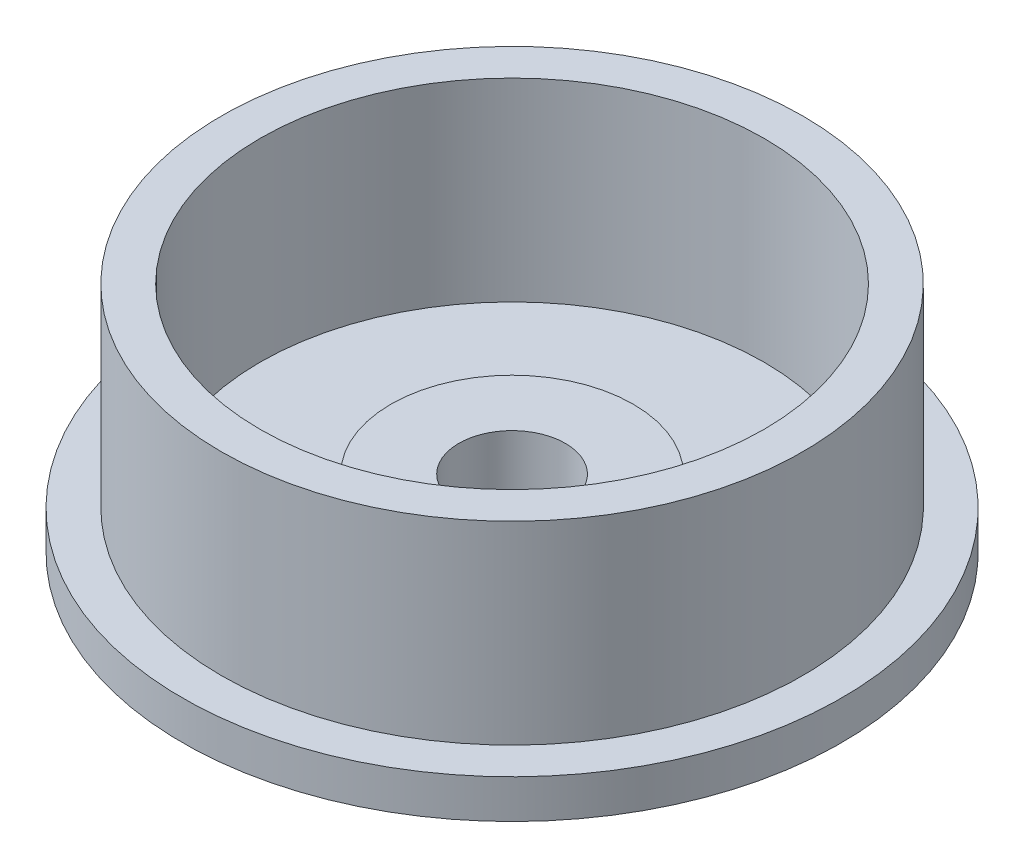
ISO-10303-21;
HEADER;
FILE_DESCRIPTION(('STEP AP214'),'2;1');
FILE_NAME('part.step','',(''),(''),'','','');
FILE_SCHEMA(('AUTOMOTIVE_DESIGN { 1 0 10303 214 1 1 1 1 }'));
ENDSEC;
DATA;
#1=APPLICATION_CONTEXT('core data for automotive mechanical design processes');
#2=APPLICATION_PROTOCOL_DEFINITION('international standard','automotive_design',2000,#1);
#3=PRODUCT_CONTEXT('',#1,'mechanical');
#4=PRODUCT('Part','Part','',(#3));
#5=PRODUCT_RELATED_PRODUCT_CATEGORY('part','',(#4));
#6=PRODUCT_DEFINITION_FORMATION('','',#4);
#7=PRODUCT_DEFINITION_CONTEXT('part definition',#1,'design');
#8=PRODUCT_DEFINITION('design','',#6,#7);
#9=PRODUCT_DEFINITION_SHAPE('','',#8);
#10=(LENGTH_UNIT() NAMED_UNIT(*) SI_UNIT(.MILLI.,.METRE.));
#11=(NAMED_UNIT(*) PLANE_ANGLE_UNIT() SI_UNIT($,.RADIAN.));
#12=(NAMED_UNIT(*) SI_UNIT($,.STERADIAN.) SOLID_ANGLE_UNIT());
#13=UNCERTAINTY_MEASURE_WITH_UNIT(LENGTH_MEASURE(1.E-05),#10,'distance_accuracy_value','');
#14=(GEOMETRIC_REPRESENTATION_CONTEXT(3) GLOBAL_UNCERTAINTY_ASSIGNED_CONTEXT((#13)) GLOBAL_UNIT_ASSIGNED_CONTEXT((#10,
#11,#12)) REPRESENTATION_CONTEXT('',''));
#15=CARTESIAN_POINT('',(0.,0.,0.));
#16=DIRECTION('',(0.,0.,1.));
#17=DIRECTION('',(1.,0.,0.));
#18=AXIS2_PLACEMENT_3D('',#15,#16,#17);
#19=CARTESIAN_POINT('',(0.,2.,0.));
#20=DIRECTION('',(0.,1.,0.));
#21=DIRECTION('',(0.,0.,1.));
#22=AXIS2_PLACEMENT_3D('',#19,#20,#21);
#23=PLANE('',#22);
#24=CARTESIAN_POINT('',(0.,2.,0.));
#25=DIRECTION('',(0.,1.,0.));
#26=DIRECTION('',(0.,0.,1.));
#27=AXIS2_PLACEMENT_3D('',#24,#25,#26);
#28=CIRCLE('',#27,13.);
#29=CARTESIAN_POINT('',(0.,2.,13.));
#30=VERTEX_POINT('',#29);
#31=EDGE_CURVE('E53',#30,#30,#28,.T.);
#32=ORIENTED_EDGE('',*,*,#31,.T.);
#33=EDGE_LOOP('',(#32));
#34=FACE_BOUND('',#33,.T.);
#35=CARTESIAN_POINT('',(0.,2.,0.));
#36=DIRECTION('',(0.,1.,0.));
#37=DIRECTION('',(0.,0.,1.));
#38=AXIS2_PLACEMENT_3D('',#35,#36,#37);
#39=CIRCLE('',#38,6.25);
#40=CARTESIAN_POINT('',(0.,2.,6.25));
#41=VERTEX_POINT('',#40);
#42=EDGE_CURVE('E71',#41,#41,#39,.T.);
#43=ORIENTED_EDGE('',*,*,#42,.F.);
#44=EDGE_LOOP('',(#43));
#45=FACE_BOUND('',#44,.T.);
#46=ADVANCED_FACE('F33',(#34,#45),#23,.T.);
#47=CARTESIAN_POINT('',(0.,0.,0.));
#48=DIRECTION('',(0.,1.,0.));
#49=DIRECTION('',(0.,0.,1.));
#50=AXIS2_PLACEMENT_3D('',#47,#48,#49);
#51=PLANE('',#50);
#52=CARTESIAN_POINT('',(0.,0.,0.));
#53=DIRECTION('',(0.,-1.,0.));
#54=DIRECTION('',(0.,0.,-1.));
#55=AXIS2_PLACEMENT_3D('',#52,#53,#54);
#56=CIRCLE('',#55,17.);
#57=CARTESIAN_POINT('',(0.,0.,-17.));
#58=VERTEX_POINT('',#57);
#59=EDGE_CURVE('E57',#58,#58,#56,.T.);
#60=ORIENTED_EDGE('',*,*,#59,.T.);
#61=EDGE_LOOP('',(#60));
#62=FACE_BOUND('',#61,.T.);
#63=CARTESIAN_POINT('',(0.,0.,0.));
#64=DIRECTION('',(0.,1.,0.));
#65=DIRECTION('',(0.,0.,1.));
#66=AXIS2_PLACEMENT_3D('',#63,#64,#65);
#67=CIRCLE('',#66,4.25);
#68=CARTESIAN_POINT('',(0.,0.,4.25));
#69=VERTEX_POINT('',#68);
#70=EDGE_CURVE('E11',#69,#69,#67,.F.);
#71=ORIENTED_EDGE('',*,*,#70,.F.);
#72=EDGE_LOOP('',(#71));
#73=FACE_BOUND('',#72,.T.);
#74=ADVANCED_FACE('F81',(#62,#73),#51,.F.);
#75=CARTESIAN_POINT('',(0.,12.,0.));
#76=DIRECTION('',(0.,-1.,0.));
#77=DIRECTION('',(0.,0.,-1.));
#78=AXIS2_PLACEMENT_3D('',#75,#76,#77);
#79=CYLINDRICAL_SURFACE('',#78,15.);
#80=CARTESIAN_POINT('',(0.,12.,0.));
#81=DIRECTION('',(0.,1.,0.));
#82=DIRECTION('',(0.,0.,1.));
#83=AXIS2_PLACEMENT_3D('',#80,#81,#82);
#84=CIRCLE('',#83,15.);
#85=CARTESIAN_POINT('',(0.,12.,15.));
#86=VERTEX_POINT('',#85);
#87=EDGE_CURVE('E44',#86,#86,#84,.T.);
#88=ORIENTED_EDGE('',*,*,#87,.F.);
#89=EDGE_LOOP('',(#88));
#90=FACE_BOUND('',#89,.T.);
#91=CARTESIAN_POINT('',(0.,2.,0.));
#92=DIRECTION('',(0.,-1.,0.));
#93=DIRECTION('',(0.,0.,-1.));
#94=AXIS2_PLACEMENT_3D('',#91,#92,#93);
#95=CIRCLE('',#94,15.);
#96=CARTESIAN_POINT('',(0.,2.,-15.));
#97=VERTEX_POINT('',#96);
#98=EDGE_CURVE('E40',#97,#97,#95,.T.);
#99=ORIENTED_EDGE('',*,*,#98,.F.);
#100=EDGE_LOOP('',(#99));
#101=FACE_BOUND('',#100,.T.);
#102=ADVANCED_FACE('F35',(#90,#101),#79,.T.);
#103=CARTESIAN_POINT('',(0.,12.,0.));
#104=DIRECTION('',(0.,1.,0.));
#105=DIRECTION('',(0.,0.,1.));
#106=AXIS2_PLACEMENT_3D('',#103,#104,#105);
#107=PLANE('',#106);
#108=CARTESIAN_POINT('',(0.,12.,0.));
#109=DIRECTION('',(0.,1.,0.));
#110=DIRECTION('',(0.,0.,1.));
#111=AXIS2_PLACEMENT_3D('',#108,#109,#110);
#112=CIRCLE('',#111,13.);
#113=CARTESIAN_POINT('',(0.,12.,13.));
#114=VERTEX_POINT('',#113);
#115=EDGE_CURVE('E48',#114,#114,#112,.T.);
#116=ORIENTED_EDGE('',*,*,#115,.F.);
#117=EDGE_LOOP('',(#116));
#118=FACE_BOUND('',#117,.T.);
#119=ORIENTED_EDGE('',*,*,#87,.T.);
#120=EDGE_LOOP('',(#119));
#121=FACE_BOUND('',#120,.T.);
#122=ADVANCED_FACE('F92',(#118,#121),#107,.T.);
#123=CARTESIAN_POINT('',(0.,12.,0.));
#124=DIRECTION('',(0.,-1.,0.));
#125=DIRECTION('',(0.,0.,-1.));
#126=AXIS2_PLACEMENT_3D('',#123,#124,#125);
#127=CYLINDRICAL_SURFACE('',#126,13.);
#128=ORIENTED_EDGE('',*,*,#115,.T.);
#129=EDGE_LOOP('',(#128));
#130=FACE_BOUND('',#129,.T.);
#131=ORIENTED_EDGE('',*,*,#31,.F.);
#132=EDGE_LOOP('',(#131));
#133=FACE_BOUND('',#132,.T.);
#134=ADVANCED_FACE('F90',(#130,#133),#127,.F.);
#135=CARTESIAN_POINT('',(0.,12.,0.));
#136=DIRECTION('',(0.,-1.,0.));
#137=DIRECTION('',(0.,0.,-1.));
#138=AXIS2_PLACEMENT_3D('',#135,#136,#137);
#139=CYLINDRICAL_SURFACE('',#138,2.75);
#140=CARTESIAN_POINT('',(0.,-4.,0.));
#141=DIRECTION('',(0.,-1.,0.));
#142=DIRECTION('',(0.,0.,-1.));
#143=AXIS2_PLACEMENT_3D('',#140,#141,#142);
#144=CIRCLE('',#143,2.75);
#145=CARTESIAN_POINT('',(0.,-4.,-2.75));
#146=VERTEX_POINT('',#145);
#147=EDGE_CURVE('E65',#146,#146,#144,.T.);
#148=ORIENTED_EDGE('',*,*,#147,.T.);
#149=EDGE_LOOP('',(#148));
#150=FACE_BOUND('',#149,.T.);
#151=CARTESIAN_POINT('',(0.,3.5,0.));
#152=DIRECTION('',(0.,-1.,0.));
#153=DIRECTION('',(0.,0.,-1.));
#154=AXIS2_PLACEMENT_3D('',#151,#152,#153);
#155=CIRCLE('',#154,2.75);
#156=CARTESIAN_POINT('',(0.,3.5,-2.75));
#157=VERTEX_POINT('',#156);
#158=EDGE_CURVE('E68',#157,#157,#155,.T.);
#159=ORIENTED_EDGE('',*,*,#158,.F.);
#160=EDGE_LOOP('',(#159));
#161=FACE_BOUND('',#160,.T.);
#162=ADVANCED_FACE('F99',(#150,#161),#139,.F.);
#163=CARTESIAN_POINT('',(0.,2.,0.));
#164=DIRECTION('',(0.,-1.,0.));
#165=DIRECTION('',(0.,0.,-1.));
#166=AXIS2_PLACEMENT_3D('',#163,#164,#165);
#167=CYLINDRICAL_SURFACE('',#166,17.);
#168=CARTESIAN_POINT('',(0.,2.,0.));
#169=DIRECTION('',(0.,-1.,0.));
#170=DIRECTION('',(0.,0.,-1.));
#171=AXIS2_PLACEMENT_3D('',#168,#169,#170);
#172=CIRCLE('',#171,17.);
#173=CARTESIAN_POINT('',(0.,2.,-17.));
#174=VERTEX_POINT('',#173);
#175=EDGE_CURVE('E56',#174,#174,#172,.T.);
#176=ORIENTED_EDGE('',*,*,#175,.T.);
#177=EDGE_LOOP('',(#176));
#178=FACE_BOUND('',#177,.T.);
#179=ORIENTED_EDGE('',*,*,#59,.F.);
#180=EDGE_LOOP('',(#179));
#181=FACE_BOUND('',#180,.T.);
#182=ADVANCED_FACE('F157',(#178,#181),#167,.T.);
#183=CARTESIAN_POINT('',(0.,2.,0.));
#184=DIRECTION('',(0.,-1.,0.));
#185=DIRECTION('',(0.,0.,-1.));
#186=AXIS2_PLACEMENT_3D('',#183,#184,#185);
#187=PLANE('',#186);
#188=ORIENTED_EDGE('',*,*,#98,.T.);
#189=EDGE_LOOP('',(#188));
#190=FACE_BOUND('',#189,.T.);
#191=ORIENTED_EDGE('',*,*,#175,.F.);
#192=EDGE_LOOP('',(#191));
#193=FACE_BOUND('',#192,.T.);
#194=ADVANCED_FACE('F124',(#190,#193),#187,.F.);
#195=CARTESIAN_POINT('',(0.,-4.,0.));
#196=DIRECTION('',(0.,-1.,0.));
#197=DIRECTION('',(0.,0.,-1.));
#198=AXIS2_PLACEMENT_3D('',#195,#196,#197);
#199=PLANE('',#198);
#200=CARTESIAN_POINT('',(0.,-4.,0.));
#201=DIRECTION('',(0.,-1.,0.));
#202=DIRECTION('',(0.,0.,-1.));
#203=AXIS2_PLACEMENT_3D('',#200,#201,#202);
#204=CIRCLE('',#203,4.25);
#205=CARTESIAN_POINT('',(0.,-4.,-4.25));
#206=VERTEX_POINT('',#205);
#207=EDGE_CURVE('E60',#206,#206,#204,.T.);
#208=ORIENTED_EDGE('',*,*,#207,.T.);
#209=EDGE_LOOP('',(#208));
#210=FACE_BOUND('',#209,.T.);
#211=ORIENTED_EDGE('',*,*,#147,.F.);
#212=EDGE_LOOP('',(#211));
#213=FACE_BOUND('',#212,.T.);
#214=ADVANCED_FACE('F128',(#210,#213),#199,.T.);
#215=CARTESIAN_POINT('',(0.,-4.,0.));
#216=DIRECTION('',(0.,1.,0.));
#217=DIRECTION('',(0.,0.,1.));
#218=AXIS2_PLACEMENT_3D('',#215,#216,#217);
#219=CYLINDRICAL_SURFACE('',#218,4.25);
#220=ORIENTED_EDGE('',*,*,#207,.F.);
#221=EDGE_LOOP('',(#220));
#222=FACE_BOUND('',#221,.T.);
#223=ORIENTED_EDGE('',*,*,#70,.T.);
#224=EDGE_LOOP('',(#223));
#225=FACE_BOUND('',#224,.T.);
#226=ADVANCED_FACE('F133',(#222,#225),#219,.T.);
#227=CARTESIAN_POINT('',(0.,28.6776695296637,0.));
#228=DIRECTION('',(0.,-1.,0.));
#229=DIRECTION('',(0.,0.,-1.));
#230=AXIS2_PLACEMENT_3D('',#227,#228,#229);
#231=CYLINDRICAL_SURFACE('',#230,6.25);
#232=CARTESIAN_POINT('',(0.,3.5,0.));
#233=DIRECTION('',(0.,-1.,0.));
#234=DIRECTION('',(0.,0.,-1.));
#235=AXIS2_PLACEMENT_3D('',#232,#233,#234);
#236=CIRCLE('',#235,6.25);
#237=CARTESIAN_POINT('',(0.,3.5,-6.25));
#238=VERTEX_POINT('',#237);
#239=EDGE_CURVE('E72',#238,#238,#236,.T.);
#240=ORIENTED_EDGE('',*,*,#239,.T.);
#241=EDGE_LOOP('',(#240));
#242=FACE_BOUND('',#241,.T.);
#243=ORIENTED_EDGE('',*,*,#42,.T.);
#244=EDGE_LOOP('',(#243));
#245=FACE_BOUND('',#244,.T.);
#246=ADVANCED_FACE('F78',(#242,#245),#231,.T.);
#247=CARTESIAN_POINT('',(0.,3.5,0.));
#248=DIRECTION('',(0.,-1.,0.));
#249=DIRECTION('',(0.,0.,-1.));
#250=AXIS2_PLACEMENT_3D('',#247,#248,#249);
#251=PLANE('',#250);
#252=ORIENTED_EDGE('',*,*,#158,.T.);
#253=EDGE_LOOP('',(#252));
#254=FACE_BOUND('',#253,.T.);
#255=ORIENTED_EDGE('',*,*,#239,.F.);
#256=EDGE_LOOP('',(#255));
#257=FACE_BOUND('',#256,.T.);
#258=ADVANCED_FACE('F166',(#254,#257),#251,.F.);
#259=CLOSED_SHELL('',(#46,#74,#102,#122,#134,#162,#182,#194,#214,#226,#246,#258));
#260=MANIFOLD_SOLID_BREP('B2',#259);
#261=ADVANCED_BREP_SHAPE_REPRESENTATION('',(#18,#260),#14);
#262=SHAPE_DEFINITION_REPRESENTATION(#9,#261);
ENDSEC;
END-ISO-10303-21;
